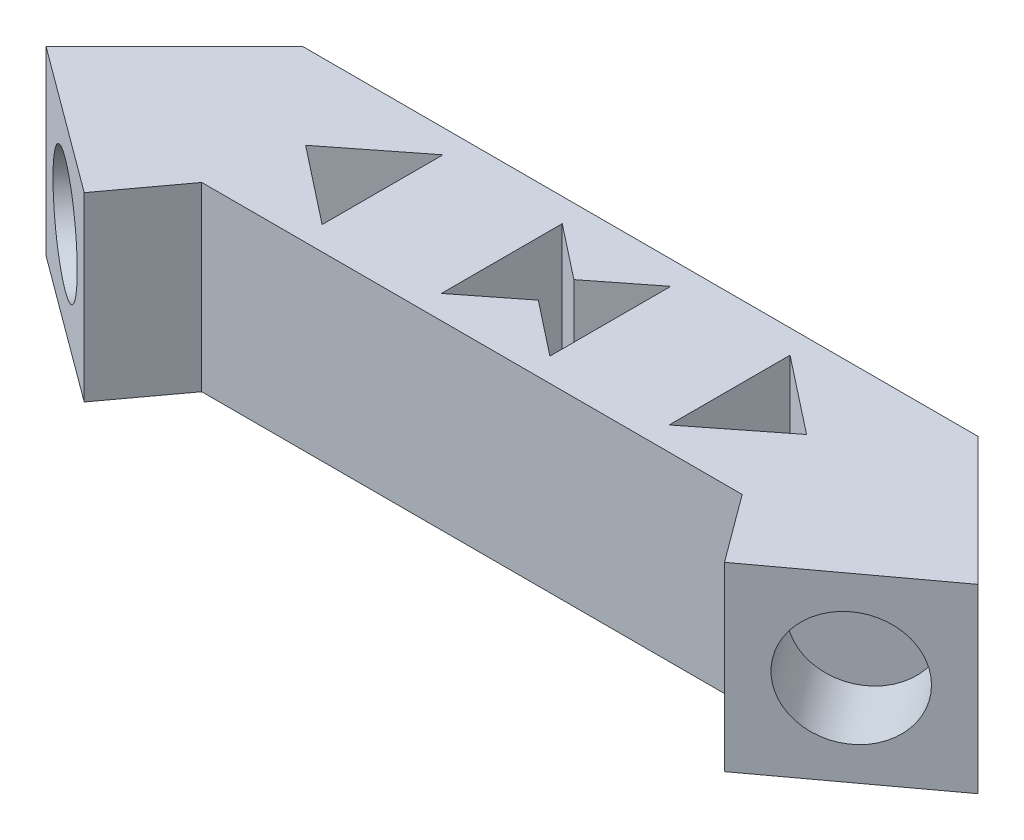
ISO-10303-21;
HEADER;
FILE_DESCRIPTION(('STEP AP214'),'2;1');
FILE_NAME('part.step','',(''),(''),'','','');
FILE_SCHEMA(('AUTOMOTIVE_DESIGN { 1 0 10303 214 1 1 1 1 }'));
ENDSEC;
DATA;
#1=APPLICATION_CONTEXT('core data for automotive mechanical design processes');
#2=APPLICATION_PROTOCOL_DEFINITION('international standard','automotive_design',2000,#1);
#3=PRODUCT_CONTEXT('',#1,'mechanical');
#4=PRODUCT('Part','Part','',(#3));
#5=PRODUCT_RELATED_PRODUCT_CATEGORY('part','',(#4));
#6=PRODUCT_DEFINITION_FORMATION('','',#4);
#7=PRODUCT_DEFINITION_CONTEXT('part definition',#1,'design');
#8=PRODUCT_DEFINITION('design','',#6,#7);
#9=PRODUCT_DEFINITION_SHAPE('','',#8);
#10=(LENGTH_UNIT() NAMED_UNIT(*) SI_UNIT(.MILLI.,.METRE.));
#11=(NAMED_UNIT(*) PLANE_ANGLE_UNIT() SI_UNIT($,.RADIAN.));
#12=(NAMED_UNIT(*) SI_UNIT($,.STERADIAN.) SOLID_ANGLE_UNIT());
#13=UNCERTAINTY_MEASURE_WITH_UNIT(LENGTH_MEASURE(1.E-05),#10,'distance_accuracy_value','');
#14=(GEOMETRIC_REPRESENTATION_CONTEXT(3) GLOBAL_UNCERTAINTY_ASSIGNED_CONTEXT((#13)) GLOBAL_UNIT_ASSIGNED_CONTEXT((#10,
#11,#12)) REPRESENTATION_CONTEXT('',''));
#15=CARTESIAN_POINT('',(0.,0.,0.));
#16=DIRECTION('',(0.,0.,1.));
#17=DIRECTION('',(1.,0.,0.));
#18=AXIS2_PLACEMENT_3D('',#15,#16,#17);
#19=CARTESIAN_POINT('',(0.,38.1,0.));
#20=DIRECTION('',(-0.804595975883322,0.,-0.593822629740873));
#21=DIRECTION('',(-0.593822629740873,0.,0.804595975883322));
#22=AXIS2_PLACEMENT_3D('',#19,#20,#21);
#23=PLANE('',#22);
#24=DIRECTION('',(0.593822629740873,0.,-0.804595975883322));
#25=VECTOR('',#24,1.);
#26=CARTESIAN_POINT('',(0.,0.,0.));
#27=LINE('',#26,#25);
#28=CARTESIAN_POINT('',(-10.4888287779957,0.,14.2117679654397));
#29=VERTEX_POINT('',#28);
#30=CARTESIAN_POINT('',(0.,0.,0.));
#31=VERTEX_POINT('',#30);
#32=EDGE_CURVE('E289',#29,#31,#27,.T.);
#33=ORIENTED_EDGE('',*,*,#32,.T.);
#34=DIRECTION('',(0.,-1.,0.));
#35=VECTOR('',#34,1.);
#36=CARTESIAN_POINT('',(0.,38.1,0.));
#37=LINE('',#36,#35);
#38=CARTESIAN_POINT('',(0.,38.1,0.));
#39=VERTEX_POINT('',#38);
#40=EDGE_CURVE('E11',#39,#31,#37,.T.);
#41=ORIENTED_EDGE('',*,*,#40,.F.);
#42=DIRECTION('',(0.593822629740873,0.,-0.804595975883322));
#43=VECTOR('',#42,1.);
#44=CARTESIAN_POINT('',(0.,38.1,0.));
#45=LINE('',#44,#43);
#46=CARTESIAN_POINT('',(-10.4888287779957,38.1,14.2117679654397));
#47=VERTEX_POINT('',#46);
#48=EDGE_CURVE('E292',#47,#39,#45,.T.);
#49=ORIENTED_EDGE('',*,*,#48,.F.);
#50=DIRECTION('',(0.,-1.,0.));
#51=VECTOR('',#50,1.);
#52=CARTESIAN_POINT('',(-10.4888287779957,38.1,14.2117679654397));
#53=LINE('',#52,#51);
#54=EDGE_CURVE('E310',#47,#29,#53,.T.);
#55=ORIENTED_EDGE('',*,*,#54,.T.);
#56=EDGE_LOOP('',(#33,#41,#49,#55));
#57=FACE_BOUND('',#56,.T.);
#58=ADVANCED_FACE('F43',(#57),#23,.F.);
#59=CARTESIAN_POINT('',(0.,38.1,0.));
#60=DIRECTION('',(0.,0.,-1.));
#61=DIRECTION('',(-1.,0.,0.));
#62=AXIS2_PLACEMENT_3D('',#59,#60,#61);
#63=PLANE('',#62);
#64=DIRECTION('',(1.,0.,0.));
#65=VECTOR('',#64,1.);
#66=CARTESIAN_POINT('',(0.,0.,0.));
#67=LINE('',#66,#65);
#68=CARTESIAN_POINT('',(113.579665808115,0.,0.));
#69=VERTEX_POINT('',#68);
#70=EDGE_CURVE('E313',#31,#69,#67,.T.);
#71=ORIENTED_EDGE('',*,*,#70,.T.);
#72=DIRECTION('',(0.,-1.,0.));
#73=VECTOR('',#72,1.);
#74=CARTESIAN_POINT('',(113.579665808115,38.1,0.));
#75=LINE('',#74,#73);
#76=CARTESIAN_POINT('',(113.579665808115,38.1,0.));
#77=VERTEX_POINT('',#76);
#78=EDGE_CURVE('E50',#77,#69,#75,.T.);
#79=ORIENTED_EDGE('',*,*,#78,.F.);
#80=DIRECTION('',(1.,0.,0.));
#81=VECTOR('',#80,1.);
#82=CARTESIAN_POINT('',(0.,38.1,0.));
#83=LINE('',#82,#81);
#84=EDGE_CURVE('E295',#39,#77,#83,.T.);
#85=ORIENTED_EDGE('',*,*,#84,.F.);
#86=ORIENTED_EDGE('',*,*,#40,.T.);
#87=EDGE_LOOP('',(#71,#79,#85,#86));
#88=FACE_BOUND('',#87,.T.);
#89=ADVANCED_FACE('F369',(#88),#63,.F.);
#90=CARTESIAN_POINT('',(113.579665808115,38.1,0.));
#91=DIRECTION('',(0.804595975883322,0.,-0.593822629740872));
#92=DIRECTION('',(-0.593822629740872,0.,-0.804595975883322));
#93=AXIS2_PLACEMENT_3D('',#90,#91,#92);
#94=PLANE('',#93);
#95=DIRECTION('',(0.593822629740872,0.,0.804595975883322));
#96=VECTOR('',#95,1.);
#97=CARTESIAN_POINT('',(113.579665808115,0.,0.));
#98=LINE('',#97,#96);
#99=CARTESIAN_POINT('',(124.06849458611,0.,14.2117679654397));
#100=VERTEX_POINT('',#99);
#101=EDGE_CURVE('E315',#69,#100,#98,.T.);
#102=ORIENTED_EDGE('',*,*,#101,.T.);
#103=DIRECTION('',(0.,-1.,0.));
#104=VECTOR('',#103,1.);
#105=CARTESIAN_POINT('',(124.06849458611,38.1,14.2117679654397));
#106=LINE('',#105,#104);
#107=CARTESIAN_POINT('',(124.06849458611,38.1,14.2117679654397));
#108=VERTEX_POINT('',#107);
#109=EDGE_CURVE('E340',#108,#100,#106,.T.);
#110=ORIENTED_EDGE('',*,*,#109,.F.);
#111=DIRECTION('',(0.593822629740872,0.,0.804595975883322));
#112=VECTOR('',#111,1.);
#113=CARTESIAN_POINT('',(113.579665808115,38.1,0.));
#114=LINE('',#113,#112);
#115=EDGE_CURVE('E298',#77,#108,#114,.T.);
#116=ORIENTED_EDGE('',*,*,#115,.F.);
#117=ORIENTED_EDGE('',*,*,#78,.T.);
#118=EDGE_LOOP('',(#102,#110,#116,#117));
#119=FACE_BOUND('',#118,.T.);
#120=ADVANCED_FACE('F347',(#119),#94,.F.);
#121=CARTESIAN_POINT('',(154.723601267265,38.1,-8.41287422768753));
#122=DIRECTION('',(-0.593822629740873,0.,-0.804595975883321));
#123=DIRECTION('',(-0.804595975883321,0.,0.593822629740873));
#124=AXIS2_PLACEMENT_3D('',#121,#122,#123);
#125=PLANE('',#124);
#126=CARTESIAN_POINT('',(139.396047926688,19.05,2.8994468688761));
#127=DIRECTION('',(0.593822629740873,0.,0.804595975883321));
#128=DIRECTION('',(0.804595975883321,0.,-0.593822629740873));
#129=AXIS2_PLACEMENT_3D('',#126,#127,#128);
#130=CIRCLE('',#129,12.065);
#131=CARTESIAN_POINT('',(149.10349837572,19.05,-4.26502315894755));
#132=VERTEX_POINT('',#131);
#133=EDGE_CURVE('E208',#132,#132,#130,.T.);
#134=ORIENTED_EDGE('',*,*,#133,.F.);
#135=EDGE_LOOP('',(#134));
#136=FACE_BOUND('',#135,.T.);
#137=DIRECTION('',(0.804595975883321,0.,-0.593822629740873));
#138=VECTOR('',#137,1.);
#139=CARTESIAN_POINT('',(154.723601267265,0.,-8.41287422768753));
#140=LINE('',#139,#138);
#141=CARTESIAN_POINT('',(154.723601267265,0.,-8.41287422768753));
#142=VERTEX_POINT('',#141);
#143=EDGE_CURVE('E317',#100,#142,#140,.T.);
#144=ORIENTED_EDGE('',*,*,#143,.T.);
#145=DIRECTION('',(0.,-1.,0.));
#146=VECTOR('',#145,1.);
#147=CARTESIAN_POINT('',(154.723601267265,38.1,-8.41287422768753));
#148=LINE('',#147,#146);
#149=CARTESIAN_POINT('',(154.723601267265,38.1,-8.41287422768753));
#150=VERTEX_POINT('',#149);
#151=EDGE_CURVE('E337',#150,#142,#148,.T.);
#152=ORIENTED_EDGE('',*,*,#151,.F.);
#153=DIRECTION('',(0.804595975883321,0.,-0.593822629740873));
#154=VECTOR('',#153,1.);
#155=CARTESIAN_POINT('',(154.723601267265,38.1,-8.41287422768753));
#156=LINE('',#155,#154);
#157=EDGE_CURVE('E300',#108,#150,#156,.T.);
#158=ORIENTED_EDGE('',*,*,#157,.F.);
#159=ORIENTED_EDGE('',*,*,#109,.T.);
#160=EDGE_LOOP('',(#144,#152,#158,#159));
#161=FACE_BOUND('',#160,.T.);
#162=ADVANCED_FACE('F357',(#136,#161),#125,.F.);
#163=CARTESIAN_POINT('',(127.782832904057,38.1,-35.3536425908948));
#164=DIRECTION('',(-0.707106781186544,0.,0.707106781186551));
#165=DIRECTION('',(0.707106781186551,0.,0.707106781186544));
#166=AXIS2_PLACEMENT_3D('',#163,#164,#165);
#167=PLANE('',#166);
#168=DIRECTION('',(-0.707106781186551,0.,-0.707106781186544));
#169=VECTOR('',#168,1.);
#170=CARTESIAN_POINT('',(127.782832904057,0.,-35.3536425908948));
#171=LINE('',#170,#169);
#172=CARTESIAN_POINT('',(127.782832904057,0.,-35.3536425908948));
#173=VERTEX_POINT('',#172);
#174=EDGE_CURVE('E319',#142,#173,#171,.T.);
#175=ORIENTED_EDGE('',*,*,#174,.T.);
#176=DIRECTION('',(0.,-1.,0.));
#177=VECTOR('',#176,1.);
#178=CARTESIAN_POINT('',(127.782832904057,38.1,-35.3536425908948));
#179=LINE('',#178,#177);
#180=CARTESIAN_POINT('',(127.782832904057,38.1,-35.3536425908948));
#181=VERTEX_POINT('',#180);
#182=EDGE_CURVE('E334',#181,#173,#179,.T.);
#183=ORIENTED_EDGE('',*,*,#182,.F.);
#184=DIRECTION('',(-0.707106781186551,0.,-0.707106781186544));
#185=VECTOR('',#184,1.);
#186=CARTESIAN_POINT('',(127.782832904057,38.1,-35.3536425908948));
#187=LINE('',#186,#185);
#188=EDGE_CURVE('E302',#150,#181,#187,.T.);
#189=ORIENTED_EDGE('',*,*,#188,.F.);
#190=ORIENTED_EDGE('',*,*,#151,.T.);
#191=EDGE_LOOP('',(#175,#183,#189,#190));
#192=FACE_BOUND('',#191,.T.);
#193=ADVANCED_FACE('F361',(#192),#167,.F.);
#194=CARTESIAN_POINT('',(-14.2031670959426,38.1,-35.3536425908948));
#195=DIRECTION('',(0.,0.,1.));
#196=DIRECTION('',(1.,0.,0.));
#197=AXIS2_PLACEMENT_3D('',#194,#195,#196);
#198=PLANE('',#197);
#199=DIRECTION('',(-1.,0.,0.));
#200=VECTOR('',#199,1.);
#201=CARTESIAN_POINT('',(-14.2031670959426,0.,-35.3536425908948));
#202=LINE('',#201,#200);
#203=CARTESIAN_POINT('',(-14.2031670959426,0.,-35.3536425908948));
#204=VERTEX_POINT('',#203);
#205=EDGE_CURVE('E321',#173,#204,#202,.T.);
#206=ORIENTED_EDGE('',*,*,#205,.T.);
#207=DIRECTION('',(0.,-1.,0.));
#208=VECTOR('',#207,1.);
#209=CARTESIAN_POINT('',(-14.2031670959426,38.1,-35.3536425908948));
#210=LINE('',#209,#208);
#211=CARTESIAN_POINT('',(-14.2031670959426,38.1,-35.3536425908948));
#212=VERTEX_POINT('',#211);
#213=EDGE_CURVE('E331',#212,#204,#210,.T.);
#214=ORIENTED_EDGE('',*,*,#213,.F.);
#215=DIRECTION('',(-1.,0.,0.));
#216=VECTOR('',#215,1.);
#217=CARTESIAN_POINT('',(-14.2031670959426,38.1,-35.3536425908948));
#218=LINE('',#217,#216);
#219=EDGE_CURVE('E304',#181,#212,#218,.T.);
#220=ORIENTED_EDGE('',*,*,#219,.F.);
#221=ORIENTED_EDGE('',*,*,#182,.T.);
#222=EDGE_LOOP('',(#206,#214,#220,#221));
#223=FACE_BOUND('',#222,.T.);
#224=ADVANCED_FACE('F382',(#223),#198,.F.);
#225=CARTESIAN_POINT('',(-14.2031670959426,38.1,-35.3536425908948));
#226=DIRECTION('',(0.707106781186544,0.,0.707106781186551));
#227=DIRECTION('',(0.707106781186551,0.,-0.707106781186544));
#228=AXIS2_PLACEMENT_3D('',#225,#226,#227);
#229=PLANE('',#228);
#230=DIRECTION('',(-0.707106781186551,0.,0.707106781186544));
#231=VECTOR('',#230,1.);
#232=CARTESIAN_POINT('',(-14.2031670959426,0.,-35.3536425908948));
#233=LINE('',#232,#231);
#234=CARTESIAN_POINT('',(-41.1439354591502,0.,-8.41287422768751));
#235=VERTEX_POINT('',#234);
#236=EDGE_CURVE('E323',#204,#235,#233,.T.);
#237=ORIENTED_EDGE('',*,*,#236,.T.);
#238=DIRECTION('',(0.,-1.,0.));
#239=VECTOR('',#238,1.);
#240=CARTESIAN_POINT('',(-41.1439354591502,38.1,-8.41287422768751));
#241=LINE('',#240,#239);
#242=CARTESIAN_POINT('',(-41.1439354591502,38.1,-8.41287422768751));
#243=VERTEX_POINT('',#242);
#244=EDGE_CURVE('E328',#243,#235,#241,.T.);
#245=ORIENTED_EDGE('',*,*,#244,.F.);
#246=DIRECTION('',(-0.707106781186551,0.,0.707106781186544));
#247=VECTOR('',#246,1.);
#248=CARTESIAN_POINT('',(-14.2031670959426,38.1,-35.3536425908948));
#249=LINE('',#248,#247);
#250=EDGE_CURVE('E306',#212,#243,#249,.T.);
#251=ORIENTED_EDGE('',*,*,#250,.F.);
#252=ORIENTED_EDGE('',*,*,#213,.T.);
#253=EDGE_LOOP('',(#237,#245,#251,#252));
#254=FACE_BOUND('',#253,.T.);
#255=ADVANCED_FACE('F380',(#254),#229,.F.);
#256=CARTESIAN_POINT('',(-41.1439354591502,38.1,-8.41287422768751));
#257=DIRECTION('',(0.593822629740873,0.,-0.804595975883321));
#258=DIRECTION('',(-0.804595975883322,0.,-0.593822629740873));
#259=AXIS2_PLACEMENT_3D('',#256,#257,#258);
#260=PLANE('',#259);
#261=CARTESIAN_POINT('',(-25.816382118573,19.05,2.89944686887611));
#262=DIRECTION('',(-0.593822629740873,0.,0.804595975883321));
#263=DIRECTION('',(0.804595975883321,0.,0.593822629740873));
#264=AXIS2_PLACEMENT_3D('',#261,#262,#263);
#265=CIRCLE('',#264,12.065);
#266=CARTESIAN_POINT('',(-16.1089316695407,19.05,10.0639168966997));
#267=VERTEX_POINT('',#266);
#268=EDGE_CURVE('E283',#267,#267,#265,.T.);
#269=ORIENTED_EDGE('',*,*,#268,.F.);
#270=EDGE_LOOP('',(#269));
#271=FACE_BOUND('',#270,.T.);
#272=DIRECTION('',(0.804595975883322,0.,0.593822629740873));
#273=VECTOR('',#272,1.);
#274=CARTESIAN_POINT('',(-41.1439354591502,0.,-8.41287422768751));
#275=LINE('',#274,#273);
#276=EDGE_CURVE('E296',#235,#29,#275,.T.);
#277=ORIENTED_EDGE('',*,*,#276,.T.);
#278=ORIENTED_EDGE('',*,*,#54,.F.);
#279=DIRECTION('',(0.804595975883322,0.,0.593822629740873));
#280=VECTOR('',#279,1.);
#281=CARTESIAN_POINT('',(-41.1439354591502,38.1,-8.41287422768751));
#282=LINE('',#281,#280);
#283=EDGE_CURVE('E308',#243,#47,#282,.T.);
#284=ORIENTED_EDGE('',*,*,#283,.F.);
#285=ORIENTED_EDGE('',*,*,#244,.T.);
#286=EDGE_LOOP('',(#277,#278,#284,#285));
#287=FACE_BOUND('',#286,.T.);
#288=ADVANCED_FACE('F375',(#271,#287),#260,.F.);
#289=CARTESIAN_POINT('',(0.,38.1,0.));
#290=DIRECTION('',(0.,1.,0.));
#291=DIRECTION('',(0.,0.,1.));
#292=AXIS2_PLACEMENT_3D('',#289,#290,#291);
#293=PLANE('',#292);
#294=DIRECTION('',(0.786407597023069,0.,0.617707933690674));
#295=VECTOR('',#294,1.);
#296=CARTESIAN_POINT('',(20.32,38.1,-4.97682129544743));
#297=LINE('',#296,#295);
#298=CARTESIAN_POINT('',(4.15155543669238,38.1,-17.6768212954474));
#299=VERTEX_POINT('',#298);
#300=CARTESIAN_POINT('',(20.32,38.1,-4.97682129544743));
#301=VERTEX_POINT('',#300);
#302=EDGE_CURVE('E57',#299,#301,#297,.T.);
#303=ORIENTED_EDGE('',*,*,#302,.F.);
#304=DIRECTION('',(-0.786407597023069,0.,0.617707933690674));
#305=VECTOR('',#304,1.);
#306=CARTESIAN_POINT('',(4.15155543669238,38.1,-17.6768212954474));
#307=LINE('',#306,#305);
#308=CARTESIAN_POINT('',(20.32,38.1,-30.3768212954474));
#309=VERTEX_POINT('',#308);
#310=EDGE_CURVE('E197',#309,#299,#307,.T.);
#311=ORIENTED_EDGE('',*,*,#310,.F.);
#312=DIRECTION('',(0.,0.,-1.));
#313=VECTOR('',#312,1.);
#314=CARTESIAN_POINT('',(20.32,38.1,-30.3768212954474));
#315=LINE('',#314,#313);
#316=EDGE_CURVE('E200',#301,#309,#315,.T.);
#317=ORIENTED_EDGE('',*,*,#316,.F.);
#318=EDGE_LOOP('',(#303,#311,#317));
#319=FACE_BOUND('',#318,.T.);
#320=DIRECTION('',(-0.786407597023069,0.,-0.617707933690674));
#321=VECTOR('',#320,1.);
#322=CARTESIAN_POINT('',(56.7898329040574,38.1,-21.4181809255694));
#323=LINE('',#322,#321);
#324=CARTESIAN_POINT('',(56.7898329040574,38.1,-21.4181809255694));
#325=VERTEX_POINT('',#324);
#326=CARTESIAN_POINT('',(45.384535251854,38.1,-30.3768212954474));
#327=VERTEX_POINT('',#326);
#328=EDGE_CURVE('E65',#325,#327,#323,.T.);
#329=ORIENTED_EDGE('',*,*,#328,.F.);
#330=DIRECTION('',(-0.786407597023069,0.,0.617707933690675));
#331=VECTOR('',#330,1.);
#332=CARTESIAN_POINT('',(56.7898329040574,38.1,-21.4181809255694));
#333=LINE('',#332,#331);
#334=CARTESIAN_POINT('',(68.1951305562608,38.1,-30.3768212954474));
#335=VERTEX_POINT('',#334);
#336=EDGE_CURVE('E224',#335,#325,#333,.T.);
#337=ORIENTED_EDGE('',*,*,#336,.F.);
#338=DIRECTION('',(0.,0.,-1.));
#339=VECTOR('',#338,1.);
#340=CARTESIAN_POINT('',(68.1951305562608,38.1,-30.3768212954474));
#341=LINE('',#340,#339);
#342=CARTESIAN_POINT('',(68.1951305562608,38.1,-4.97682129544743));
#343=VERTEX_POINT('',#342);
#344=EDGE_CURVE('E227',#343,#335,#341,.T.);
#345=ORIENTED_EDGE('',*,*,#344,.F.);
#346=DIRECTION('',(0.786407597023069,0.,0.617707933690674));
#347=VECTOR('',#346,1.);
#348=CARTESIAN_POINT('',(68.1951305562608,38.1,-4.97682129544743));
#349=LINE('',#348,#347);
#350=CARTESIAN_POINT('',(56.7898329040574,38.1,-13.9354616653255));
#351=VERTEX_POINT('',#350);
#352=EDGE_CURVE('E231',#351,#343,#349,.T.);
#353=ORIENTED_EDGE('',*,*,#352,.F.);
#354=DIRECTION('',(0.786407597023069,0.,-0.617707933690675));
#355=VECTOR('',#354,1.);
#356=CARTESIAN_POINT('',(45.384535251854,38.1,-4.97682129544743));
#357=LINE('',#356,#355);
#358=CARTESIAN_POINT('',(45.384535251854,38.1,-4.97682129544743));
#359=VERTEX_POINT('',#358);
#360=EDGE_CURVE('E234',#359,#351,#357,.T.);
#361=ORIENTED_EDGE('',*,*,#360,.F.);
#362=DIRECTION('',(0.,0.,1.));
#363=VECTOR('',#362,1.);
#364=CARTESIAN_POINT('',(45.384535251854,38.1,-30.3768212954474));
#365=LINE('',#364,#363);
#366=EDGE_CURVE('E237',#327,#359,#365,.T.);
#367=ORIENTED_EDGE('',*,*,#366,.F.);
#368=EDGE_LOOP('',(#329,#337,#345,#353,#361,#367));
#369=FACE_BOUND('',#368,.T.);
#370=DIRECTION('',(-0.786407597023069,0.,-0.617707933690674));
#371=VECTOR('',#370,1.);
#372=CARTESIAN_POINT('',(109.428110371422,38.1,-17.6768212954474));
#373=LINE('',#372,#371);
#374=CARTESIAN_POINT('',(109.428110371422,38.1,-17.6768212954474));
#375=VERTEX_POINT('',#374);
#376=CARTESIAN_POINT('',(93.2596658081147,38.1,-30.3768212954474));
#377=VERTEX_POINT('',#376);
#378=EDGE_CURVE('E223',#375,#377,#373,.T.);
#379=ORIENTED_EDGE('',*,*,#378,.F.);
#380=DIRECTION('',(0.786407597023068,0.,-0.617707933690675));
#381=VECTOR('',#380,1.);
#382=CARTESIAN_POINT('',(93.2596658081148,38.1,-4.97682129544743));
#383=LINE('',#382,#381);
#384=CARTESIAN_POINT('',(93.2596658081148,38.1,-4.97682129544743));
#385=VERTEX_POINT('',#384);
#386=EDGE_CURVE('E265',#385,#375,#383,.T.);
#387=ORIENTED_EDGE('',*,*,#386,.F.);
#388=DIRECTION('',(0.,0.,1.));
#389=VECTOR('',#388,1.);
#390=CARTESIAN_POINT('',(93.2596658081147,38.1,-30.3768212954474));
#391=LINE('',#390,#389);
#392=EDGE_CURVE('E268',#377,#385,#391,.T.);
#393=ORIENTED_EDGE('',*,*,#392,.F.);
#394=EDGE_LOOP('',(#379,#387,#393));
#395=FACE_BOUND('',#394,.T.);
#396=ORIENTED_EDGE('',*,*,#48,.T.);
#397=ORIENTED_EDGE('',*,*,#84,.T.);
#398=ORIENTED_EDGE('',*,*,#115,.T.);
#399=ORIENTED_EDGE('',*,*,#157,.T.);
#400=ORIENTED_EDGE('',*,*,#188,.T.);
#401=ORIENTED_EDGE('',*,*,#219,.T.);
#402=ORIENTED_EDGE('',*,*,#250,.T.);
#403=ORIENTED_EDGE('',*,*,#283,.T.);
#404=EDGE_LOOP('',(#396,#397,#398,#399,#400,#401,#402,#403));
#405=FACE_BOUND('',#404,.T.);
#406=ADVANCED_FACE('F365',(#319,#369,#395,#405),#293,.T.);
#407=CARTESIAN_POINT('',(0.,0.,0.));
#408=DIRECTION('',(0.,1.,0.));
#409=DIRECTION('',(0.,0.,1.));
#410=AXIS2_PLACEMENT_3D('',#407,#408,#409);
#411=PLANE('',#410);
#412=DIRECTION('',(-0.786407597023069,0.,0.617707933690674));
#413=VECTOR('',#412,1.);
#414=CARTESIAN_POINT('',(4.15155543669238,0.,-17.6768212954474));
#415=LINE('',#414,#413);
#416=CARTESIAN_POINT('',(20.32,0.,-30.3768212954474));
#417=VERTEX_POINT('',#416);
#418=CARTESIAN_POINT('',(4.15155543669238,0.,-17.6768212954474));
#419=VERTEX_POINT('',#418);
#420=EDGE_CURVE('E187',#417,#419,#415,.T.);
#421=ORIENTED_EDGE('',*,*,#420,.T.);
#422=DIRECTION('',(0.786407597023069,0.,0.617707933690674));
#423=VECTOR('',#422,1.);
#424=CARTESIAN_POINT('',(20.32,0.,-4.97682129544743));
#425=LINE('',#424,#423);
#426=CARTESIAN_POINT('',(20.32,0.,-4.97682129544743));
#427=VERTEX_POINT('',#426);
#428=EDGE_CURVE('E181',#419,#427,#425,.T.);
#429=ORIENTED_EDGE('',*,*,#428,.T.);
#430=DIRECTION('',(0.,0.,-1.));
#431=VECTOR('',#430,1.);
#432=CARTESIAN_POINT('',(20.32,0.,-30.3768212954474));
#433=LINE('',#432,#431);
#434=EDGE_CURVE('E191',#427,#417,#433,.T.);
#435=ORIENTED_EDGE('',*,*,#434,.T.);
#436=EDGE_LOOP('',(#421,#429,#435));
#437=FACE_BOUND('',#436,.T.);
#438=DIRECTION('',(-0.786407597023069,0.,0.617707933690675));
#439=VECTOR('',#438,1.);
#440=CARTESIAN_POINT('',(56.7898329040574,0.,-21.4181809255694));
#441=LINE('',#440,#439);
#442=CARTESIAN_POINT('',(68.1951305562608,0.,-30.3768212954474));
#443=VERTEX_POINT('',#442);
#444=CARTESIAN_POINT('',(56.7898329040574,0.,-21.4181809255694));
#445=VERTEX_POINT('',#444);
#446=EDGE_CURVE('E212',#443,#445,#441,.T.);
#447=ORIENTED_EDGE('',*,*,#446,.T.);
#448=DIRECTION('',(-0.786407597023069,0.,-0.617707933690674));
#449=VECTOR('',#448,1.);
#450=CARTESIAN_POINT('',(56.7898329040574,0.,-21.4181809255694));
#451=LINE('',#450,#449);
#452=CARTESIAN_POINT('',(45.384535251854,0.,-30.3768212954474));
#453=VERTEX_POINT('',#452);
#454=EDGE_CURVE('E228',#445,#453,#451,.T.);
#455=ORIENTED_EDGE('',*,*,#454,.T.);
#456=DIRECTION('',(0.,0.,1.));
#457=VECTOR('',#456,1.);
#458=CARTESIAN_POINT('',(45.384535251854,0.,-30.3768212954474));
#459=LINE('',#458,#457);
#460=CARTESIAN_POINT('',(45.384535251854,0.,-4.97682129544743));
#461=VERTEX_POINT('',#460);
#462=EDGE_CURVE('E252',#453,#461,#459,.T.);
#463=ORIENTED_EDGE('',*,*,#462,.T.);
#464=DIRECTION('',(0.786407597023069,0.,-0.617707933690675));
#465=VECTOR('',#464,1.);
#466=CARTESIAN_POINT('',(45.384535251854,0.,-4.97682129544743));
#467=LINE('',#466,#465);
#468=CARTESIAN_POINT('',(56.7898329040574,0.,-13.9354616653255));
#469=VERTEX_POINT('',#468);
#470=EDGE_CURVE('E249',#461,#469,#467,.T.);
#471=ORIENTED_EDGE('',*,*,#470,.T.);
#472=DIRECTION('',(0.786407597023069,0.,0.617707933690674));
#473=VECTOR('',#472,1.);
#474=CARTESIAN_POINT('',(68.1951305562608,0.,-4.97682129544743));
#475=LINE('',#474,#473);
#476=CARTESIAN_POINT('',(68.1951305562608,0.,-4.97682129544743));
#477=VERTEX_POINT('',#476);
#478=EDGE_CURVE('E246',#469,#477,#475,.T.);
#479=ORIENTED_EDGE('',*,*,#478,.T.);
#480=DIRECTION('',(0.,0.,-1.));
#481=VECTOR('',#480,1.);
#482=CARTESIAN_POINT('',(68.1951305562608,0.,-30.3768212954474));
#483=LINE('',#482,#481);
#484=EDGE_CURVE('E243',#477,#443,#483,.T.);
#485=ORIENTED_EDGE('',*,*,#484,.T.);
#486=EDGE_LOOP('',(#447,#455,#463,#471,#479,#485));
#487=FACE_BOUND('',#486,.T.);
#488=DIRECTION('',(0.786407597023068,0.,-0.617707933690675));
#489=VECTOR('',#488,1.);
#490=CARTESIAN_POINT('',(93.2596658081148,0.,-4.97682129544743));
#491=LINE('',#490,#489);
#492=CARTESIAN_POINT('',(93.2596658081148,0.,-4.97682129544743));
#493=VERTEX_POINT('',#492);
#494=CARTESIAN_POINT('',(109.428110371422,0.,-17.6768212954474));
#495=VERTEX_POINT('',#494);
#496=EDGE_CURVE('E260',#493,#495,#491,.T.);
#497=ORIENTED_EDGE('',*,*,#496,.T.);
#498=DIRECTION('',(-0.786407597023069,0.,-0.617707933690674));
#499=VECTOR('',#498,1.);
#500=CARTESIAN_POINT('',(109.428110371422,0.,-17.6768212954474));
#501=LINE('',#500,#499);
#502=CARTESIAN_POINT('',(93.2596658081147,0.,-30.3768212954474));
#503=VERTEX_POINT('',#502);
#504=EDGE_CURVE('E269',#495,#503,#501,.T.);
#505=ORIENTED_EDGE('',*,*,#504,.T.);
#506=DIRECTION('',(0.,0.,1.));
#507=VECTOR('',#506,1.);
#508=CARTESIAN_POINT('',(93.2596658081147,0.,-30.3768212954474));
#509=LINE('',#508,#507);
#510=EDGE_CURVE('E275',#503,#493,#509,.T.);
#511=ORIENTED_EDGE('',*,*,#510,.T.);
#512=EDGE_LOOP('',(#497,#505,#511));
#513=FACE_BOUND('',#512,.T.);
#514=ORIENTED_EDGE('',*,*,#32,.F.);
#515=ORIENTED_EDGE('',*,*,#276,.F.);
#516=ORIENTED_EDGE('',*,*,#236,.F.);
#517=ORIENTED_EDGE('',*,*,#205,.F.);
#518=ORIENTED_EDGE('',*,*,#174,.F.);
#519=ORIENTED_EDGE('',*,*,#143,.F.);
#520=ORIENTED_EDGE('',*,*,#101,.F.);
#521=ORIENTED_EDGE('',*,*,#70,.F.);
#522=EDGE_LOOP('',(#514,#515,#516,#517,#518,#519,#520,#521));
#523=FACE_BOUND('',#522,.T.);
#524=ADVANCED_FACE('F195',(#437,#487,#513,#523),#411,.F.);
#525=CARTESIAN_POINT('',(-16.7665252413221,19.05,-9.36259580358571));
#526=DIRECTION('',(-0.593822629740873,0.,0.804595975883321));
#527=DIRECTION('',(0.804595975883322,0.,0.593822629740873));
#528=AXIS2_PLACEMENT_3D('',#525,#526,#527);
#529=CYLINDRICAL_SURFACE('',#528,12.065);
#530=CARTESIAN_POINT('',(-16.7665252413221,19.05,-9.36259580358571));
#531=DIRECTION('',(-0.593822629740873,0.,0.804595975883321));
#532=DIRECTION('',(0.804595975883321,0.,0.593822629740873));
#533=AXIS2_PLACEMENT_3D('',#530,#531,#532);
#534=CIRCLE('',#533,12.065);
#535=CARTESIAN_POINT('',(-7.0590747922898,19.05,-2.19812577576208));
#536=VERTEX_POINT('',#535);
#537=EDGE_CURVE('E286',#536,#536,#534,.T.);
#538=ORIENTED_EDGE('',*,*,#537,.F.);
#539=EDGE_LOOP('',(#538));
#540=FACE_BOUND('',#539,.T.);
#541=ORIENTED_EDGE('',*,*,#268,.T.);
#542=EDGE_LOOP('',(#541));
#543=FACE_BOUND('',#542,.T.);
#544=ADVANCED_FACE('F419',(#540,#543),#529,.F.);
#545=CARTESIAN_POINT('',(-16.7665252413221,19.05,-9.36259580358571));
#546=DIRECTION('',(-0.593822629740873,0.,0.804595975883321));
#547=DIRECTION('',(0.804595975883321,0.,0.593822629740873));
#548=AXIS2_PLACEMENT_3D('',#545,#546,#547);
#549=PLANE('',#548);
#550=ORIENTED_EDGE('',*,*,#537,.T.);
#551=EDGE_LOOP('',(#550));
#552=FACE_BOUND('',#551,.T.);
#553=ADVANCED_FACE('F410',(#552),#549,.T.);
#554=CARTESIAN_POINT('',(130.346191049437,19.05,-9.36259580358572));
#555=DIRECTION('',(0.593822629740873,0.,0.804595975883321));
#556=DIRECTION('',(0.804595975883321,0.,-0.593822629740873));
#557=AXIS2_PLACEMENT_3D('',#554,#555,#556);
#558=CYLINDRICAL_SURFACE('',#557,12.065);
#559=CARTESIAN_POINT('',(130.346191049437,19.05,-9.36259580358572));
#560=DIRECTION('',(0.593822629740873,0.,0.804595975883321));
#561=DIRECTION('',(0.804595975883321,0.,-0.593822629740873));
#562=AXIS2_PLACEMENT_3D('',#559,#560,#561);
#563=CIRCLE('',#562,12.065);
#564=CARTESIAN_POINT('',(140.053641498469,19.05,-16.5270658314094));
#565=VERTEX_POINT('',#564);
#566=EDGE_CURVE('E280',#565,#565,#563,.T.);
#567=ORIENTED_EDGE('',*,*,#566,.F.);
#568=EDGE_LOOP('',(#567));
#569=FACE_BOUND('',#568,.T.);
#570=ORIENTED_EDGE('',*,*,#133,.T.);
#571=EDGE_LOOP('',(#570));
#572=FACE_BOUND('',#571,.T.);
#573=ADVANCED_FACE('F408',(#569,#572),#558,.F.);
#574=CARTESIAN_POINT('',(130.346191049437,19.05,-9.36259580358572));
#575=DIRECTION('',(0.593822629740873,0.,0.804595975883321));
#576=DIRECTION('',(0.804595975883321,0.,-0.593822629740873));
#577=AXIS2_PLACEMENT_3D('',#574,#575,#576);
#578=PLANE('',#577);
#579=ORIENTED_EDGE('',*,*,#566,.T.);
#580=EDGE_LOOP('',(#579));
#581=FACE_BOUND('',#580,.T.);
#582=ADVANCED_FACE('F409',(#581),#578,.T.);
#583=CARTESIAN_POINT('',(109.428110371422,0.,-17.6768212954474));
#584=DIRECTION('',(0.617707933690674,0.,-0.786407597023069));
#585=DIRECTION('',(-0.786407597023069,0.,-0.617707933690674));
#586=AXIS2_PLACEMENT_3D('',#583,#584,#585);
#587=PLANE('',#586);
#588=ORIENTED_EDGE('',*,*,#378,.T.);
#589=DIRECTION('',(0.,1.,0.));
#590=VECTOR('',#589,1.);
#591=CARTESIAN_POINT('',(93.2596658081147,0.,-30.3768212954474));
#592=LINE('',#591,#590);
#593=EDGE_CURVE('E257',#503,#377,#592,.T.);
#594=ORIENTED_EDGE('',*,*,#593,.F.);
#595=ORIENTED_EDGE('',*,*,#504,.F.);
#596=DIRECTION('',(0.,1.,0.));
#597=VECTOR('',#596,1.);
#598=CARTESIAN_POINT('',(109.428110371422,0.,-17.6768212954474));
#599=LINE('',#598,#597);
#600=EDGE_CURVE('E263',#495,#375,#599,.T.);
#601=ORIENTED_EDGE('',*,*,#600,.T.);
#602=EDGE_LOOP('',(#588,#594,#595,#601));
#603=FACE_BOUND('',#602,.T.);
#604=ADVANCED_FACE('F416',(#603),#587,.F.);
#605=CARTESIAN_POINT('',(93.2596658081148,0.,-4.97682129544743));
#606=DIRECTION('',(0.617707933690675,0.,0.786407597023068));
#607=DIRECTION('',(0.786407597023068,0.,-0.617707933690675));
#608=AXIS2_PLACEMENT_3D('',#605,#606,#607);
#609=PLANE('',#608);
#610=ORIENTED_EDGE('',*,*,#386,.T.);
#611=ORIENTED_EDGE('',*,*,#600,.F.);
#612=ORIENTED_EDGE('',*,*,#496,.F.);
#613=DIRECTION('',(0.,1.,0.));
#614=VECTOR('',#613,1.);
#615=CARTESIAN_POINT('',(93.2596658081148,0.,-4.97682129544743));
#616=LINE('',#615,#614);
#617=EDGE_CURVE('E261',#493,#385,#616,.T.);
#618=ORIENTED_EDGE('',*,*,#617,.T.);
#619=EDGE_LOOP('',(#610,#611,#612,#618));
#620=FACE_BOUND('',#619,.T.);
#621=ADVANCED_FACE('F473',(#620),#609,.F.);
#622=CARTESIAN_POINT('',(93.2596658081147,0.,-30.3768212954474));
#623=DIRECTION('',(-1.,0.,0.));
#624=DIRECTION('',(0.,0.,1.));
#625=AXIS2_PLACEMENT_3D('',#622,#623,#624);
#626=PLANE('',#625);
#627=ORIENTED_EDGE('',*,*,#392,.T.);
#628=ORIENTED_EDGE('',*,*,#617,.F.);
#629=ORIENTED_EDGE('',*,*,#510,.F.);
#630=ORIENTED_EDGE('',*,*,#593,.T.);
#631=EDGE_LOOP('',(#627,#628,#629,#630));
#632=FACE_BOUND('',#631,.T.);
#633=ADVANCED_FACE('F483',(#632),#626,.F.);
#634=CARTESIAN_POINT('',(56.7898329040574,0.,-21.4181809255694));
#635=DIRECTION('',(0.617707933690674,0.,-0.786407597023069));
#636=DIRECTION('',(-0.786407597023069,0.,-0.617707933690674));
#637=AXIS2_PLACEMENT_3D('',#634,#635,#636);
#638=PLANE('',#637);
#639=ORIENTED_EDGE('',*,*,#328,.T.);
#640=DIRECTION('',(0.,1.,0.));
#641=VECTOR('',#640,1.);
#642=CARTESIAN_POINT('',(45.384535251854,0.,-30.3768212954474));
#643=LINE('',#642,#641);
#644=EDGE_CURVE('E210',#453,#327,#643,.T.);
#645=ORIENTED_EDGE('',*,*,#644,.F.);
#646=ORIENTED_EDGE('',*,*,#454,.F.);
#647=DIRECTION('',(0.,1.,0.));
#648=VECTOR('',#647,1.);
#649=CARTESIAN_POINT('',(56.7898329040574,0.,-21.4181809255694));
#650=LINE('',#649,#648);
#651=EDGE_CURVE('E221',#445,#325,#650,.T.);
#652=ORIENTED_EDGE('',*,*,#651,.T.);
#653=EDGE_LOOP('',(#639,#645,#646,#652));
#654=FACE_BOUND('',#653,.T.);
#655=ADVANCED_FACE('F492',(#654),#638,.F.);
#656=CARTESIAN_POINT('',(56.7898329040574,0.,-21.4181809255694));
#657=DIRECTION('',(-0.617707933690675,0.,-0.786407597023069));
#658=DIRECTION('',(-0.786407597023069,0.,0.617707933690675));
#659=AXIS2_PLACEMENT_3D('',#656,#657,#658);
#660=PLANE('',#659);
#661=ORIENTED_EDGE('',*,*,#336,.T.);
#662=ORIENTED_EDGE('',*,*,#651,.F.);
#663=ORIENTED_EDGE('',*,*,#446,.F.);
#664=DIRECTION('',(0.,1.,0.));
#665=VECTOR('',#664,1.);
#666=CARTESIAN_POINT('',(68.1951305562608,0.,-30.3768212954474));
#667=LINE('',#666,#665);
#668=EDGE_CURVE('E219',#443,#335,#667,.T.);
#669=ORIENTED_EDGE('',*,*,#668,.T.);
#670=EDGE_LOOP('',(#661,#662,#663,#669));
#671=FACE_BOUND('',#670,.T.);
#672=ADVANCED_FACE('F502',(#671),#660,.F.);
#673=CARTESIAN_POINT('',(68.1951305562608,0.,-30.3768212954474));
#674=DIRECTION('',(1.,0.,0.));
#675=DIRECTION('',(0.,0.,-1.));
#676=AXIS2_PLACEMENT_3D('',#673,#674,#675);
#677=PLANE('',#676);
#678=ORIENTED_EDGE('',*,*,#344,.T.);
#679=ORIENTED_EDGE('',*,*,#668,.F.);
#680=ORIENTED_EDGE('',*,*,#484,.F.);
#681=DIRECTION('',(0.,1.,0.));
#682=VECTOR('',#681,1.);
#683=CARTESIAN_POINT('',(68.1951305562608,0.,-4.97682129544743));
#684=LINE('',#683,#682);
#685=EDGE_CURVE('E217',#477,#343,#684,.T.);
#686=ORIENTED_EDGE('',*,*,#685,.T.);
#687=EDGE_LOOP('',(#678,#679,#680,#686));
#688=FACE_BOUND('',#687,.T.);
#689=ADVANCED_FACE('F511',(#688),#677,.F.);
#690=CARTESIAN_POINT('',(68.1951305562608,0.,-4.97682129544743));
#691=DIRECTION('',(-0.617707933690674,0.,0.786407597023069));
#692=DIRECTION('',(0.786407597023069,0.,0.617707933690674));
#693=AXIS2_PLACEMENT_3D('',#690,#691,#692);
#694=PLANE('',#693);
#695=ORIENTED_EDGE('',*,*,#352,.T.);
#696=ORIENTED_EDGE('',*,*,#685,.F.);
#697=ORIENTED_EDGE('',*,*,#478,.F.);
#698=DIRECTION('',(0.,1.,0.));
#699=VECTOR('',#698,1.);
#700=CARTESIAN_POINT('',(56.7898329040574,0.,-13.9354616653255));
#701=LINE('',#700,#699);
#702=EDGE_CURVE('E215',#469,#351,#701,.T.);
#703=ORIENTED_EDGE('',*,*,#702,.T.);
#704=EDGE_LOOP('',(#695,#696,#697,#703));
#705=FACE_BOUND('',#704,.T.);
#706=ADVANCED_FACE('F521',(#705),#694,.F.);
#707=CARTESIAN_POINT('',(45.384535251854,0.,-4.97682129544743));
#708=DIRECTION('',(0.617707933690675,0.,0.786407597023069));
#709=DIRECTION('',(0.786407597023069,0.,-0.617707933690675));
#710=AXIS2_PLACEMENT_3D('',#707,#708,#709);
#711=PLANE('',#710);
#712=ORIENTED_EDGE('',*,*,#360,.T.);
#713=ORIENTED_EDGE('',*,*,#702,.F.);
#714=ORIENTED_EDGE('',*,*,#470,.F.);
#715=DIRECTION('',(0.,1.,0.));
#716=VECTOR('',#715,1.);
#717=CARTESIAN_POINT('',(45.384535251854,0.,-4.97682129544743));
#718=LINE('',#717,#716);
#719=EDGE_CURVE('E213',#461,#359,#718,.T.);
#720=ORIENTED_EDGE('',*,*,#719,.T.);
#721=EDGE_LOOP('',(#712,#713,#714,#720));
#722=FACE_BOUND('',#721,.T.);
#723=ADVANCED_FACE('F531',(#722),#711,.F.);
#724=CARTESIAN_POINT('',(45.384535251854,0.,-30.3768212954474));
#725=DIRECTION('',(-1.,0.,0.));
#726=DIRECTION('',(0.,0.,1.));
#727=AXIS2_PLACEMENT_3D('',#724,#725,#726);
#728=PLANE('',#727);
#729=ORIENTED_EDGE('',*,*,#366,.T.);
#730=ORIENTED_EDGE('',*,*,#719,.F.);
#731=ORIENTED_EDGE('',*,*,#462,.F.);
#732=ORIENTED_EDGE('',*,*,#644,.T.);
#733=EDGE_LOOP('',(#729,#730,#731,#732));
#734=FACE_BOUND('',#733,.T.);
#735=ADVANCED_FACE('F541',(#734),#728,.F.);
#736=CARTESIAN_POINT('',(20.32,0.,-4.97682129544743));
#737=DIRECTION('',(-0.617707933690675,0.,0.786407597023069));
#738=DIRECTION('',(0.786407597023069,0.,0.617707933690674));
#739=AXIS2_PLACEMENT_3D('',#736,#737,#738);
#740=PLANE('',#739);
#741=ORIENTED_EDGE('',*,*,#302,.T.);
#742=DIRECTION('',(0.,1.,0.));
#743=VECTOR('',#742,1.);
#744=CARTESIAN_POINT('',(20.32,0.,-4.97682129544743));
#745=LINE('',#744,#743);
#746=EDGE_CURVE('E177',#427,#301,#745,.T.);
#747=ORIENTED_EDGE('',*,*,#746,.F.);
#748=ORIENTED_EDGE('',*,*,#428,.F.);
#749=DIRECTION('',(0.,1.,0.));
#750=VECTOR('',#749,1.);
#751=CARTESIAN_POINT('',(4.15155543669238,0.,-17.6768212954474));
#752=LINE('',#751,#750);
#753=EDGE_CURVE('E206',#419,#299,#752,.T.);
#754=ORIENTED_EDGE('',*,*,#753,.T.);
#755=EDGE_LOOP('',(#741,#747,#748,#754));
#756=FACE_BOUND('',#755,.T.);
#757=ADVANCED_FACE('F179',(#756),#740,.F.);
#758=CARTESIAN_POINT('',(4.15155543669238,0.,-17.6768212954474));
#759=DIRECTION('',(-0.617707933690675,0.,-0.786407597023069));
#760=DIRECTION('',(-0.786407597023069,0.,0.617707933690674));
#761=AXIS2_PLACEMENT_3D('',#758,#759,#760);
#762=PLANE('',#761);
#763=ORIENTED_EDGE('',*,*,#310,.T.);
#764=ORIENTED_EDGE('',*,*,#753,.F.);
#765=ORIENTED_EDGE('',*,*,#420,.F.);
#766=DIRECTION('',(0.,1.,0.));
#767=VECTOR('',#766,1.);
#768=CARTESIAN_POINT('',(20.32,0.,-30.3768212954474));
#769=LINE('',#768,#767);
#770=EDGE_CURVE('E186',#417,#309,#769,.T.);
#771=ORIENTED_EDGE('',*,*,#770,.T.);
#772=EDGE_LOOP('',(#763,#764,#765,#771));
#773=FACE_BOUND('',#772,.T.);
#774=ADVANCED_FACE('F560',(#773),#762,.F.);
#775=CARTESIAN_POINT('',(20.32,0.,-30.3768212954474));
#776=DIRECTION('',(1.,0.,0.));
#777=DIRECTION('',(0.,0.,-1.));
#778=AXIS2_PLACEMENT_3D('',#775,#776,#777);
#779=PLANE('',#778);
#780=ORIENTED_EDGE('',*,*,#316,.T.);
#781=ORIENTED_EDGE('',*,*,#770,.F.);
#782=ORIENTED_EDGE('',*,*,#434,.F.);
#783=ORIENTED_EDGE('',*,*,#746,.T.);
#784=EDGE_LOOP('',(#780,#781,#782,#783));
#785=FACE_BOUND('',#784,.T.);
#786=ADVANCED_FACE('F192',(#785),#779,.F.);
#787=CLOSED_SHELL('',(#58,#89,#120,#162,#193,#224,#255,#288,#406,#524,#544,#553,#573,#582,#604,
#621,#633,#655,#672,#689,#706,#723,#735,#757,#774,#786));
#788=MANIFOLD_SOLID_BREP('B2',#787);
#789=ADVANCED_BREP_SHAPE_REPRESENTATION('',(#18,#788),#14);
#790=SHAPE_DEFINITION_REPRESENTATION(#9,#789);
ENDSEC;
END-ISO-10303-21;
